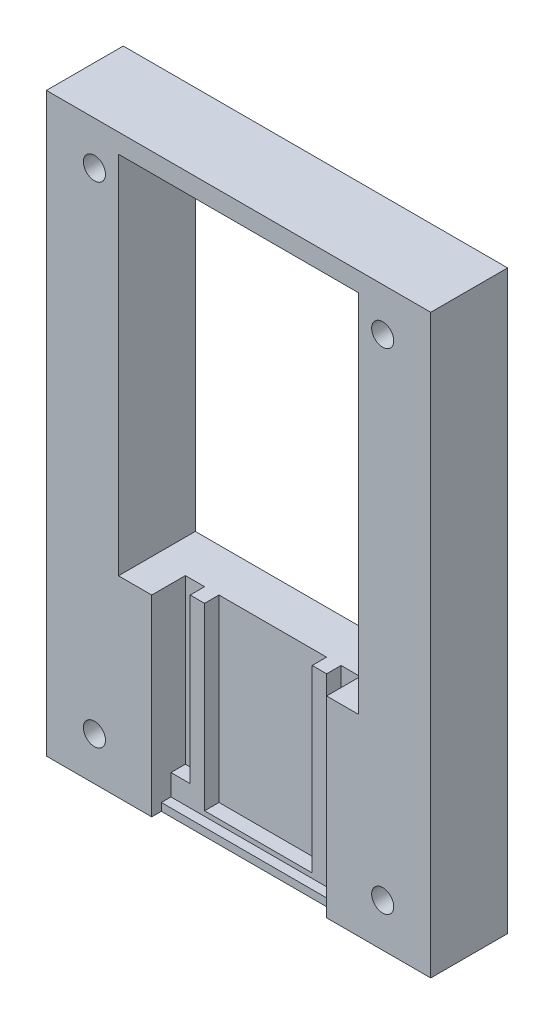
ISO-10303-21;
HEADER;
FILE_DESCRIPTION(('STEP AP214'),'2;1');
FILE_NAME('part.step','',(''),(''),'','','');
FILE_SCHEMA(('AUTOMOTIVE_DESIGN { 1 0 10303 214 1 1 1 1 }'));
ENDSEC;
DATA;
#1=APPLICATION_CONTEXT('core data for automotive mechanical design processes');
#2=APPLICATION_PROTOCOL_DEFINITION('international standard','automotive_design',2000,#1);
#3=PRODUCT_CONTEXT('',#1,'mechanical');
#4=PRODUCT('Part','Part','',(#3));
#5=PRODUCT_RELATED_PRODUCT_CATEGORY('part','',(#4));
#6=PRODUCT_DEFINITION_FORMATION('','',#4);
#7=PRODUCT_DEFINITION_CONTEXT('part definition',#1,'design');
#8=PRODUCT_DEFINITION('design','',#6,#7);
#9=PRODUCT_DEFINITION_SHAPE('','',#8);
#10=(LENGTH_UNIT() NAMED_UNIT(*) SI_UNIT(.MILLI.,.METRE.));
#11=(NAMED_UNIT(*) PLANE_ANGLE_UNIT() SI_UNIT($,.RADIAN.));
#12=(NAMED_UNIT(*) SI_UNIT($,.STERADIAN.) SOLID_ANGLE_UNIT());
#13=UNCERTAINTY_MEASURE_WITH_UNIT(LENGTH_MEASURE(1.E-05),#10,'distance_accuracy_value','');
#14=(GEOMETRIC_REPRESENTATION_CONTEXT(3) GLOBAL_UNCERTAINTY_ASSIGNED_CONTEXT((#13)) GLOBAL_UNIT_ASSIGNED_CONTEXT((#10,
#11,#12)) REPRESENTATION_CONTEXT('',''));
#15=CARTESIAN_POINT('',(0.,0.,0.));
#16=DIRECTION('',(0.,0.,1.));
#17=DIRECTION('',(1.,0.,0.));
#18=AXIS2_PLACEMENT_3D('',#15,#16,#17);
#19=CARTESIAN_POINT('',(0.,0.,6.));
#20=DIRECTION('',(0.,0.,-1.));
#21=DIRECTION('',(-1.,0.,0.));
#22=AXIS2_PLACEMENT_3D('',#19,#20,#21);
#23=PLANE('',#22);
#24=DIRECTION('',(0.,1.,0.));
#25=VECTOR('',#24,1.);
#26=CARTESIAN_POINT('',(25.6625098567106,1.3,6.));
#27=LINE('',#26,#25);
#28=CARTESIAN_POINT('',(25.6625098567106,1.3,6.));
#29=VERTEX_POINT('',#28);
#30=CARTESIAN_POINT('',(25.6625098567106,20.,6.));
#31=VERTEX_POINT('',#30);
#32=EDGE_CURVE('E221',#29,#31,#27,.T.);
#33=ORIENTED_EDGE('',*,*,#32,.F.);
#34=DIRECTION('',(1.,0.,0.));
#35=VECTOR('',#34,1.);
#36=CARTESIAN_POINT('',(25.6625098567106,1.3,6.));
#37=LINE('',#36,#35);
#38=CARTESIAN_POINT('',(14.4625098567106,1.3,6.));
#39=VERTEX_POINT('',#38);
#40=EDGE_CURVE('E205',#39,#29,#37,.T.);
#41=ORIENTED_EDGE('',*,*,#40,.F.);
#42=DIRECTION('',(0.,-1.,0.));
#43=VECTOR('',#42,1.);
#44=CARTESIAN_POINT('',(14.4625098567106,1.3,6.));
#45=LINE('',#44,#43);
#46=CARTESIAN_POINT('',(14.4625098567106,20.,6.));
#47=VERTEX_POINT('',#46);
#48=EDGE_CURVE('E219',#47,#39,#45,.T.);
#49=ORIENTED_EDGE('',*,*,#48,.F.);
#50=DIRECTION('',(1.,0.,0.));
#51=VECTOR('',#50,1.);
#52=CARTESIAN_POINT('',(7.5,20.,6.));
#53=LINE('',#52,#51);
#54=CARTESIAN_POINT('',(12.9625098567106,20.,6.));
#55=VERTEX_POINT('',#54);
#56=EDGE_CURVE('E401',#55,#47,#53,.T.);
#57=ORIENTED_EDGE('',*,*,#56,.F.);
#58=DIRECTION('',(0.,1.,0.));
#59=VECTOR('',#58,1.);
#60=CARTESIAN_POINT('',(12.9625098567106,20.,6.));
#61=LINE('',#60,#59);
#62=CARTESIAN_POINT('',(12.9625098567106,3.,6.));
#63=VERTEX_POINT('',#62);
#64=EDGE_CURVE('E253',#63,#55,#61,.T.);
#65=ORIENTED_EDGE('',*,*,#64,.F.);
#66=DIRECTION('',(1.,0.,0.));
#67=VECTOR('',#66,1.);
#68=CARTESIAN_POINT('',(10.9625098567106,3.,6.));
#69=LINE('',#68,#67);
#70=CARTESIAN_POINT('',(10.9625098567106,3.,6.));
#71=VERTEX_POINT('',#70);
#72=EDGE_CURVE('E261',#71,#63,#69,.T.);
#73=ORIENTED_EDGE('',*,*,#72,.F.);
#74=DIRECTION('',(0.,-1.,0.));
#75=VECTOR('',#74,1.);
#76=CARTESIAN_POINT('',(10.9625098567106,0.,6.));
#77=LINE('',#76,#75);
#78=CARTESIAN_POINT('',(10.9625098567106,0.8,6.));
#79=VERTEX_POINT('',#78);
#80=EDGE_CURVE('E297',#71,#79,#77,.T.);
#81=ORIENTED_EDGE('',*,*,#80,.T.);
#82=DIRECTION('',(-1.,0.,0.));
#83=VECTOR('',#82,1.);
#84=CARTESIAN_POINT('',(10.9625098567106,0.8,6.));
#85=LINE('',#84,#83);
#86=CARTESIAN_POINT('',(29.1625098567106,0.8,6.));
#87=VERTEX_POINT('',#86);
#88=EDGE_CURVE('E229',#87,#79,#85,.T.);
#89=ORIENTED_EDGE('',*,*,#88,.F.);
#90=DIRECTION('',(0.,1.,0.));
#91=VECTOR('',#90,1.);
#92=CARTESIAN_POINT('',(29.1625098567106,0.,6.));
#93=LINE('',#92,#91);
#94=CARTESIAN_POINT('',(29.1625098567106,3.,6.));
#95=VERTEX_POINT('',#94);
#96=EDGE_CURVE('E303',#87,#95,#93,.T.);
#97=ORIENTED_EDGE('',*,*,#96,.T.);
#98=DIRECTION('',(1.,0.,0.));
#99=VECTOR('',#98,1.);
#100=CARTESIAN_POINT('',(29.1625098567106,3.,6.));
#101=LINE('',#100,#99);
#102=CARTESIAN_POINT('',(27.1625098567106,3.,6.));
#103=VERTEX_POINT('',#102);
#104=EDGE_CURVE('E281',#103,#95,#101,.T.);
#105=ORIENTED_EDGE('',*,*,#104,.F.);
#106=DIRECTION('',(0.,-1.,0.));
#107=VECTOR('',#106,1.);
#108=CARTESIAN_POINT('',(27.1625098567106,20.,6.));
#109=LINE('',#108,#107);
#110=CARTESIAN_POINT('',(27.1625098567106,20.,6.));
#111=VERTEX_POINT('',#110);
#112=EDGE_CURVE('E267',#111,#103,#109,.T.);
#113=ORIENTED_EDGE('',*,*,#112,.F.);
#114=EDGE_CURVE('E405',#31,#111,#53,.T.);
#115=ORIENTED_EDGE('',*,*,#114,.F.);
#116=EDGE_LOOP('',(#33,#41,#49,#57,#65,#73,#81,#89,#97,#105,#113,#115));
#117=FACE_BOUND('',#116,.T.);
#118=ADVANCED_FACE('F39',(#117),#23,.F.);
#119=CARTESIAN_POINT('',(10.9625098567106,0.,6.));
#120=DIRECTION('',(-1.,0.,0.));
#121=DIRECTION('',(0.,0.,1.));
#122=AXIS2_PLACEMENT_3D('',#119,#120,#121);
#123=PLANE('',#122);
#124=DIRECTION('',(0.,-1.,0.));
#125=VECTOR('',#124,1.);
#126=CARTESIAN_POINT('',(10.9625098567106,0.,7.));
#127=LINE('',#126,#125);
#128=CARTESIAN_POINT('',(10.9625098567106,0.8,7.));
#129=VERTEX_POINT('',#128);
#130=CARTESIAN_POINT('',(10.9625098567106,0.,7.));
#131=VERTEX_POINT('',#130);
#132=EDGE_CURVE('E61',#129,#131,#127,.T.);
#133=ORIENTED_EDGE('',*,*,#132,.F.);
#134=DIRECTION('',(0.,0.,-1.));
#135=VECTOR('',#134,1.);
#136=CARTESIAN_POINT('',(10.9625098567106,0.8,7.));
#137=LINE('',#136,#135);
#138=EDGE_CURVE('E243',#129,#79,#137,.T.);
#139=ORIENTED_EDGE('',*,*,#138,.T.);
#140=ORIENTED_EDGE('',*,*,#80,.F.);
#141=DIRECTION('',(0.,0.,1.));
#142=VECTOR('',#141,1.);
#143=CARTESIAN_POINT('',(10.9625098567106,3.,4.5));
#144=LINE('',#143,#142);
#145=CARTESIAN_POINT('',(10.9625098567106,3.,4.5));
#146=VERTEX_POINT('',#145);
#147=EDGE_CURVE('E264',#146,#71,#144,.T.);
#148=ORIENTED_EDGE('',*,*,#147,.F.);
#149=DIRECTION('',(0.,-1.,0.));
#150=VECTOR('',#149,1.);
#151=CARTESIAN_POINT('',(10.9625098567106,20.,4.5));
#152=LINE('',#151,#150);
#153=CARTESIAN_POINT('',(10.9625098567106,20.,4.5));
#154=VERTEX_POINT('',#153);
#155=EDGE_CURVE('E252',#154,#146,#152,.T.);
#156=ORIENTED_EDGE('',*,*,#155,.F.);
#157=DIRECTION('',(0.,0.,-1.));
#158=VECTOR('',#157,1.);
#159=CARTESIAN_POINT('',(10.9625098567106,20.,0.));
#160=LINE('',#159,#158);
#161=CARTESIAN_POINT('',(10.9625098567106,20.,8.));
#162=VERTEX_POINT('',#161);
#163=EDGE_CURVE('E11',#162,#154,#160,.T.);
#164=ORIENTED_EDGE('',*,*,#163,.F.);
#165=DIRECTION('',(0.,-1.,0.));
#166=VECTOR('',#165,1.);
#167=CARTESIAN_POINT('',(10.9625098567106,0.,8.));
#168=LINE('',#167,#166);
#169=CARTESIAN_POINT('',(10.9625098567106,0.,8.));
#170=VERTEX_POINT('',#169);
#171=EDGE_CURVE('E275',#162,#170,#168,.T.);
#172=ORIENTED_EDGE('',*,*,#171,.T.);
#173=DIRECTION('',(0.,0.,1.));
#174=VECTOR('',#173,1.);
#175=CARTESIAN_POINT('',(10.9625098567106,0.,6.));
#176=LINE('',#175,#174);
#177=EDGE_CURVE('E306',#131,#170,#176,.T.);
#178=ORIENTED_EDGE('',*,*,#177,.F.);
#179=EDGE_LOOP('',(#133,#139,#140,#148,#156,#164,#172,#178));
#180=FACE_BOUND('',#179,.T.);
#181=ADVANCED_FACE('F434',(#180),#123,.F.);
#182=CARTESIAN_POINT('',(29.1625098567106,0.,6.));
#183=DIRECTION('',(1.,0.,0.));
#184=DIRECTION('',(0.,0.,-1.));
#185=AXIS2_PLACEMENT_3D('',#182,#183,#184);
#186=PLANE('',#185);
#187=DIRECTION('',(0.,0.,-1.));
#188=VECTOR('',#187,1.);
#189=CARTESIAN_POINT('',(29.1625098567106,0.8,7.));
#190=LINE('',#189,#188);
#191=CARTESIAN_POINT('',(29.1625098567106,0.8,7.));
#192=VERTEX_POINT('',#191);
#193=EDGE_CURVE('E250',#192,#87,#190,.T.);
#194=ORIENTED_EDGE('',*,*,#193,.F.);
#195=DIRECTION('',(0.,1.,0.));
#196=VECTOR('',#195,1.);
#197=CARTESIAN_POINT('',(29.1625098567106,0.,7.));
#198=LINE('',#197,#196);
#199=CARTESIAN_POINT('',(29.1625098567106,0.,7.));
#200=VERTEX_POINT('',#199);
#201=EDGE_CURVE('E238',#200,#192,#198,.T.);
#202=ORIENTED_EDGE('',*,*,#201,.F.);
#203=DIRECTION('',(0.,0.,1.));
#204=VECTOR('',#203,1.);
#205=CARTESIAN_POINT('',(29.1625098567106,0.,6.));
#206=LINE('',#205,#204);
#207=CARTESIAN_POINT('',(29.1625098567106,0.,8.));
#208=VERTEX_POINT('',#207);
#209=EDGE_CURVE('E309',#200,#208,#206,.T.);
#210=ORIENTED_EDGE('',*,*,#209,.T.);
#211=DIRECTION('',(0.,1.,0.));
#212=VECTOR('',#211,1.);
#213=CARTESIAN_POINT('',(29.1625098567106,0.,8.));
#214=LINE('',#213,#212);
#215=CARTESIAN_POINT('',(29.1625098567106,20.,8.));
#216=VERTEX_POINT('',#215);
#217=EDGE_CURVE('E302',#208,#216,#214,.T.);
#218=ORIENTED_EDGE('',*,*,#217,.T.);
#219=DIRECTION('',(0.,0.,1.));
#220=VECTOR('',#219,1.);
#221=CARTESIAN_POINT('',(29.1625098567106,20.,0.));
#222=LINE('',#221,#220);
#223=CARTESIAN_POINT('',(29.1625098567106,20.,4.5));
#224=VERTEX_POINT('',#223);
#225=EDGE_CURVE('E50',#224,#216,#222,.T.);
#226=ORIENTED_EDGE('',*,*,#225,.F.);
#227=DIRECTION('',(0.,1.,0.));
#228=VECTOR('',#227,1.);
#229=CARTESIAN_POINT('',(29.1625098567106,20.,4.5));
#230=LINE('',#229,#228);
#231=CARTESIAN_POINT('',(29.1625098567106,3.,4.5));
#232=VERTEX_POINT('',#231);
#233=EDGE_CURVE('E287',#232,#224,#230,.T.);
#234=ORIENTED_EDGE('',*,*,#233,.F.);
#235=DIRECTION('',(0.,0.,1.));
#236=VECTOR('',#235,1.);
#237=CARTESIAN_POINT('',(29.1625098567106,3.,4.5));
#238=LINE('',#237,#236);
#239=EDGE_CURVE('E249',#232,#95,#238,.T.);
#240=ORIENTED_EDGE('',*,*,#239,.T.);
#241=ORIENTED_EDGE('',*,*,#96,.F.);
#242=EDGE_LOOP('',(#194,#202,#210,#218,#226,#234,#240,#241));
#243=FACE_BOUND('',#242,.T.);
#244=ADVANCED_FACE('F467',(#243),#186,.F.);
#245=CARTESIAN_POINT('',(0.,0.,8.));
#246=DIRECTION('',(0.,1.,0.));
#247=DIRECTION('',(-1.,0.,0.));
#248=AXIS2_PLACEMENT_3D('',#245,#246,#247);
#249=PLANE('',#248);
#250=DIRECTION('',(1.,0.,0.));
#251=VECTOR('',#250,1.);
#252=CARTESIAN_POINT('',(10.9625098567106,0.,7.));
#253=LINE('',#252,#251);
#254=EDGE_CURVE('E232',#131,#200,#253,.T.);
#255=ORIENTED_EDGE('',*,*,#254,.F.);
#256=ORIENTED_EDGE('',*,*,#177,.T.);
#257=DIRECTION('',(1.,0.,0.));
#258=VECTOR('',#257,1.);
#259=CARTESIAN_POINT('',(0.,0.,8.));
#260=LINE('',#259,#258);
#261=CARTESIAN_POINT('',(0.,0.,8.));
#262=VERTEX_POINT('',#261);
#263=EDGE_CURVE('E375',#262,#170,#260,.T.);
#264=ORIENTED_EDGE('',*,*,#263,.F.);
#265=DIRECTION('',(0.,0.,-1.));
#266=VECTOR('',#265,1.);
#267=CARTESIAN_POINT('',(0.,0.,8.));
#268=LINE('',#267,#266);
#269=CARTESIAN_POINT('',(0.,0.,0.));
#270=VERTEX_POINT('',#269);
#271=EDGE_CURVE('E385',#262,#270,#268,.T.);
#272=ORIENTED_EDGE('',*,*,#271,.T.);
#273=DIRECTION('',(1.,0.,0.));
#274=VECTOR('',#273,1.);
#275=CARTESIAN_POINT('',(0.,0.,0.));
#276=LINE('',#275,#274);
#277=CARTESIAN_POINT('',(40.,0.,0.));
#278=VERTEX_POINT('',#277);
#279=EDGE_CURVE('E367',#270,#278,#276,.T.);
#280=ORIENTED_EDGE('',*,*,#279,.T.);
#281=DIRECTION('',(0.,0.,-1.));
#282=VECTOR('',#281,1.);
#283=CARTESIAN_POINT('',(40.,0.,8.));
#284=LINE('',#283,#282);
#285=CARTESIAN_POINT('',(40.,0.,8.));
#286=VERTEX_POINT('',#285);
#287=EDGE_CURVE('E398',#286,#278,#284,.T.);
#288=ORIENTED_EDGE('',*,*,#287,.F.);
#289=EDGE_CURVE('E376',#208,#286,#260,.T.);
#290=ORIENTED_EDGE('',*,*,#289,.F.);
#291=ORIENTED_EDGE('',*,*,#209,.F.);
#292=EDGE_LOOP('',(#255,#256,#264,#272,#280,#288,#290,#291));
#293=FACE_BOUND('',#292,.T.);
#294=ADVANCED_FACE('F41',(#293),#249,.F.);
#295=CARTESIAN_POINT('',(40.,0.,8.));
#296=DIRECTION('',(-1.,0.,0.));
#297=DIRECTION('',(0.,0.,1.));
#298=AXIS2_PLACEMENT_3D('',#295,#296,#297);
#299=PLANE('',#298);
#300=DIRECTION('',(0.,1.,0.));
#301=VECTOR('',#300,1.);
#302=CARTESIAN_POINT('',(40.,0.,0.));
#303=LINE('',#302,#301);
#304=CARTESIAN_POINT('',(40.,60.,0.));
#305=VERTEX_POINT('',#304);
#306=EDGE_CURVE('E383',#278,#305,#303,.T.);
#307=ORIENTED_EDGE('',*,*,#306,.T.);
#308=DIRECTION('',(0.,0.,-1.));
#309=VECTOR('',#308,1.);
#310=CARTESIAN_POINT('',(40.,60.,8.));
#311=LINE('',#310,#309);
#312=CARTESIAN_POINT('',(40.,60.,8.));
#313=VERTEX_POINT('',#312);
#314=EDGE_CURVE('E396',#313,#305,#311,.T.);
#315=ORIENTED_EDGE('',*,*,#314,.F.);
#316=DIRECTION('',(0.,1.,0.));
#317=VECTOR('',#316,1.);
#318=CARTESIAN_POINT('',(40.,0.,8.));
#319=LINE('',#318,#317);
#320=EDGE_CURVE('E374',#286,#313,#319,.T.);
#321=ORIENTED_EDGE('',*,*,#320,.F.);
#322=ORIENTED_EDGE('',*,*,#287,.T.);
#323=EDGE_LOOP('',(#307,#315,#321,#322));
#324=FACE_BOUND('',#323,.T.);
#325=ADVANCED_FACE('F476',(#324),#299,.F.);
#326=CARTESIAN_POINT('',(0.,60.,8.));
#327=DIRECTION('',(0.,-1.,0.));
#328=DIRECTION('',(1.,0.,0.));
#329=AXIS2_PLACEMENT_3D('',#326,#327,#328);
#330=PLANE('',#329);
#331=DIRECTION('',(-1.,0.,0.));
#332=VECTOR('',#331,1.);
#333=CARTESIAN_POINT('',(0.,60.,0.));
#334=LINE('',#333,#332);
#335=CARTESIAN_POINT('',(0.,60.,0.));
#336=VERTEX_POINT('',#335);
#337=EDGE_CURVE('E386',#305,#336,#334,.T.);
#338=ORIENTED_EDGE('',*,*,#337,.T.);
#339=DIRECTION('',(0.,0.,-1.));
#340=VECTOR('',#339,1.);
#341=CARTESIAN_POINT('',(0.,60.,8.));
#342=LINE('',#341,#340);
#343=CARTESIAN_POINT('',(0.,60.,8.));
#344=VERTEX_POINT('',#343);
#345=EDGE_CURVE('E394',#344,#336,#342,.T.);
#346=ORIENTED_EDGE('',*,*,#345,.F.);
#347=DIRECTION('',(-1.,0.,0.));
#348=VECTOR('',#347,1.);
#349=CARTESIAN_POINT('',(0.,60.,8.));
#350=LINE('',#349,#348);
#351=EDGE_CURVE('E377',#313,#344,#350,.T.);
#352=ORIENTED_EDGE('',*,*,#351,.F.);
#353=ORIENTED_EDGE('',*,*,#314,.T.);
#354=EDGE_LOOP('',(#338,#346,#352,#353));
#355=FACE_BOUND('',#354,.T.);
#356=ADVANCED_FACE('F483',(#355),#330,.F.);
#357=CARTESIAN_POINT('',(0.,0.,8.));
#358=DIRECTION('',(1.,0.,0.));
#359=DIRECTION('',(0.,0.,-1.));
#360=AXIS2_PLACEMENT_3D('',#357,#358,#359);
#361=PLANE('',#360);
#362=DIRECTION('',(0.,-1.,0.));
#363=VECTOR('',#362,1.);
#364=CARTESIAN_POINT('',(0.,0.,0.));
#365=LINE('',#364,#363);
#366=EDGE_CURVE('E388',#336,#270,#365,.T.);
#367=ORIENTED_EDGE('',*,*,#366,.T.);
#368=ORIENTED_EDGE('',*,*,#271,.F.);
#369=DIRECTION('',(0.,-1.,0.));
#370=VECTOR('',#369,1.);
#371=CARTESIAN_POINT('',(0.,0.,8.));
#372=LINE('',#371,#370);
#373=EDGE_CURVE('E379',#344,#262,#372,.T.);
#374=ORIENTED_EDGE('',*,*,#373,.F.);
#375=ORIENTED_EDGE('',*,*,#345,.T.);
#376=EDGE_LOOP('',(#367,#368,#374,#375));
#377=FACE_BOUND('',#376,.T.);
#378=ADVANCED_FACE('F486',(#377),#361,.F.);
#379=CARTESIAN_POINT('',(0.,0.,8.));
#380=DIRECTION('',(0.,0.,1.));
#381=DIRECTION('',(1.,0.,0.));
#382=AXIS2_PLACEMENT_3D('',#379,#380,#381);
#383=PLANE('',#382);
#384=ORIENTED_EDGE('',*,*,#171,.F.);
#385=DIRECTION('',(1.,0.,0.));
#386=VECTOR('',#385,1.);
#387=CARTESIAN_POINT('',(7.5,20.,8.));
#388=LINE('',#387,#386);
#389=CARTESIAN_POINT('',(7.5,20.,8.));
#390=VERTEX_POINT('',#389);
#391=EDGE_CURVE('E328',#390,#162,#388,.T.);
#392=ORIENTED_EDGE('',*,*,#391,.F.);
#393=DIRECTION('',(0.,-1.,0.));
#394=VECTOR('',#393,1.);
#395=CARTESIAN_POINT('',(7.5,58.,8.));
#396=LINE('',#395,#394);
#397=CARTESIAN_POINT('',(7.5,58.,8.));
#398=VERTEX_POINT('',#397);
#399=EDGE_CURVE('E315',#398,#390,#396,.T.);
#400=ORIENTED_EDGE('',*,*,#399,.F.);
#401=DIRECTION('',(-1.,0.,0.));
#402=VECTOR('',#401,1.);
#403=CARTESIAN_POINT('',(7.5,58.,8.));
#404=LINE('',#403,#402);
#405=CARTESIAN_POINT('',(32.5,58.,8.));
#406=VERTEX_POINT('',#405);
#407=EDGE_CURVE('E319',#406,#398,#404,.T.);
#408=ORIENTED_EDGE('',*,*,#407,.F.);
#409=DIRECTION('',(0.,1.,0.));
#410=VECTOR('',#409,1.);
#411=CARTESIAN_POINT('',(32.5,58.,8.));
#412=LINE('',#411,#410);
#413=CARTESIAN_POINT('',(32.5,20.,8.));
#414=VERTEX_POINT('',#413);
#415=EDGE_CURVE('E334',#414,#406,#412,.T.);
#416=ORIENTED_EDGE('',*,*,#415,.F.);
#417=EDGE_CURVE('E326',#216,#414,#388,.T.);
#418=ORIENTED_EDGE('',*,*,#417,.F.);
#419=ORIENTED_EDGE('',*,*,#217,.F.);
#420=ORIENTED_EDGE('',*,*,#289,.T.);
#421=ORIENTED_EDGE('',*,*,#320,.T.);
#422=ORIENTED_EDGE('',*,*,#351,.T.);
#423=ORIENTED_EDGE('',*,*,#373,.T.);
#424=ORIENTED_EDGE('',*,*,#263,.T.);
#425=EDGE_LOOP('',(#384,#392,#400,#408,#416,#418,#419,#420,#421,#422,#423,#424));
#426=FACE_BOUND('',#425,.T.);
#427=CARTESIAN_POINT('',(35.,4.5,8.));
#428=DIRECTION('',(0.,0.,1.));
#429=DIRECTION('',(1.,0.,0.));
#430=AXIS2_PLACEMENT_3D('',#427,#428,#429);
#431=CIRCLE('',#430,1.15);
#432=CARTESIAN_POINT('',(36.15,4.5,8.));
#433=VERTEX_POINT('',#432);
#434=EDGE_CURVE('E353',#433,#433,#431,.T.);
#435=ORIENTED_EDGE('',*,*,#434,.F.);
#436=EDGE_LOOP('',(#435));
#437=FACE_BOUND('',#436,.T.);
#438=CARTESIAN_POINT('',(5.00000000000001,55.5,8.));
#439=DIRECTION('',(0.,0.,1.));
#440=DIRECTION('',(1.,0.,0.));
#441=AXIS2_PLACEMENT_3D('',#438,#439,#440);
#442=CIRCLE('',#441,1.15);
#443=CARTESIAN_POINT('',(6.15000000000001,55.5,8.));
#444=VERTEX_POINT('',#443);
#445=EDGE_CURVE('E363',#444,#444,#442,.T.);
#446=ORIENTED_EDGE('',*,*,#445,.F.);
#447=EDGE_LOOP('',(#446));
#448=FACE_BOUND('',#447,.T.);
#449=CARTESIAN_POINT('',(35.,55.5,8.));
#450=DIRECTION('',(0.,0.,1.));
#451=DIRECTION('',(1.,0.,0.));
#452=AXIS2_PLACEMENT_3D('',#449,#450,#451);
#453=CIRCLE('',#452,1.15);
#454=CARTESIAN_POINT('',(36.15,55.5,8.));
#455=VERTEX_POINT('',#454);
#456=EDGE_CURVE('E349',#455,#455,#453,.T.);
#457=ORIENTED_EDGE('',*,*,#456,.F.);
#458=EDGE_LOOP('',(#457));
#459=FACE_BOUND('',#458,.T.);
#460=CARTESIAN_POINT('',(5.00000000000001,4.5,8.));
#461=DIRECTION('',(0.,0.,1.));
#462=DIRECTION('',(1.,0.,0.));
#463=AXIS2_PLACEMENT_3D('',#460,#461,#462);
#464=CIRCLE('',#463,1.15);
#465=CARTESIAN_POINT('',(6.15000000000001,4.5,8.));
#466=VERTEX_POINT('',#465);
#467=EDGE_CURVE('E357',#466,#466,#464,.T.);
#468=ORIENTED_EDGE('',*,*,#467,.F.);
#469=EDGE_LOOP('',(#468));
#470=FACE_BOUND('',#469,.T.);
#471=ADVANCED_FACE('F419',(#426,#437,#448,#459,#470),#383,.T.);
#472=CARTESIAN_POINT('',(0.,0.,0.));
#473=DIRECTION('',(0.,0.,1.));
#474=DIRECTION('',(1.,0.,0.));
#475=AXIS2_PLACEMENT_3D('',#472,#473,#474);
#476=PLANE('',#475);
#477=DIRECTION('',(-1.,0.,0.));
#478=VECTOR('',#477,1.);
#479=CARTESIAN_POINT('',(7.5,58.,0.));
#480=LINE('',#479,#478);
#481=CARTESIAN_POINT('',(32.5,58.,0.));
#482=VERTEX_POINT('',#481);
#483=CARTESIAN_POINT('',(7.5,58.,0.));
#484=VERTEX_POINT('',#483);
#485=EDGE_CURVE('E323',#482,#484,#480,.T.);
#486=ORIENTED_EDGE('',*,*,#485,.T.);
#487=DIRECTION('',(0.,-1.,0.));
#488=VECTOR('',#487,1.);
#489=CARTESIAN_POINT('',(7.5,58.,0.));
#490=LINE('',#489,#488);
#491=CARTESIAN_POINT('',(7.5,20.,0.));
#492=VERTEX_POINT('',#491);
#493=EDGE_CURVE('E313',#484,#492,#490,.T.);
#494=ORIENTED_EDGE('',*,*,#493,.T.);
#495=DIRECTION('',(1.,0.,0.));
#496=VECTOR('',#495,1.);
#497=CARTESIAN_POINT('',(7.5,20.,0.));
#498=LINE('',#497,#496);
#499=CARTESIAN_POINT('',(32.5,20.,0.));
#500=VERTEX_POINT('',#499);
#501=EDGE_CURVE('E320',#492,#500,#498,.T.);
#502=ORIENTED_EDGE('',*,*,#501,.T.);
#503=DIRECTION('',(0.,1.,0.));
#504=VECTOR('',#503,1.);
#505=CARTESIAN_POINT('',(32.5,58.,0.));
#506=LINE('',#505,#504);
#507=EDGE_CURVE('E324',#500,#482,#506,.T.);
#508=ORIENTED_EDGE('',*,*,#507,.T.);
#509=EDGE_LOOP('',(#486,#494,#502,#508));
#510=FACE_BOUND('',#509,.T.);
#511=CARTESIAN_POINT('',(35.,4.5,0.));
#512=DIRECTION('',(0.,0.,1.));
#513=DIRECTION('',(1.,0.,0.));
#514=AXIS2_PLACEMENT_3D('',#511,#512,#513);
#515=CIRCLE('',#514,1.15);
#516=CARTESIAN_POINT('',(36.15,4.5,0.));
#517=VERTEX_POINT('',#516);
#518=EDGE_CURVE('E356',#517,#517,#515,.T.);
#519=ORIENTED_EDGE('',*,*,#518,.T.);
#520=EDGE_LOOP('',(#519));
#521=FACE_BOUND('',#520,.T.);
#522=CARTESIAN_POINT('',(5.00000000000001,55.5,0.));
#523=DIRECTION('',(0.,0.,1.));
#524=DIRECTION('',(1.,0.,0.));
#525=AXIS2_PLACEMENT_3D('',#522,#523,#524);
#526=CIRCLE('',#525,1.15);
#527=CARTESIAN_POINT('',(6.15000000000001,55.5,0.));
#528=VERTEX_POINT('',#527);
#529=EDGE_CURVE('E351',#528,#528,#526,.T.);
#530=ORIENTED_EDGE('',*,*,#529,.T.);
#531=EDGE_LOOP('',(#530));
#532=FACE_BOUND('',#531,.T.);
#533=CARTESIAN_POINT('',(35.,55.5,0.));
#534=DIRECTION('',(0.,0.,1.));
#535=DIRECTION('',(1.,0.,0.));
#536=AXIS2_PLACEMENT_3D('',#533,#534,#535);
#537=CIRCLE('',#536,1.15);
#538=CARTESIAN_POINT('',(36.15,55.5,0.));
#539=VERTEX_POINT('',#538);
#540=EDGE_CURVE('E338',#539,#539,#537,.T.);
#541=ORIENTED_EDGE('',*,*,#540,.T.);
#542=EDGE_LOOP('',(#541));
#543=FACE_BOUND('',#542,.T.);
#544=CARTESIAN_POINT('',(5.00000000000001,4.5,0.));
#545=DIRECTION('',(0.,0.,1.));
#546=DIRECTION('',(1.,0.,0.));
#547=AXIS2_PLACEMENT_3D('',#544,#545,#546);
#548=CIRCLE('',#547,1.15);
#549=CARTESIAN_POINT('',(6.15000000000001,4.5,0.));
#550=VERTEX_POINT('',#549);
#551=EDGE_CURVE('E366',#550,#550,#548,.T.);
#552=ORIENTED_EDGE('',*,*,#551,.T.);
#553=EDGE_LOOP('',(#552));
#554=FACE_BOUND('',#553,.T.);
#555=ORIENTED_EDGE('',*,*,#279,.F.);
#556=ORIENTED_EDGE('',*,*,#366,.F.);
#557=ORIENTED_EDGE('',*,*,#337,.F.);
#558=ORIENTED_EDGE('',*,*,#306,.F.);
#559=EDGE_LOOP('',(#555,#556,#557,#558));
#560=FACE_BOUND('',#559,.T.);
#561=ADVANCED_FACE('F426',(#510,#521,#532,#543,#554,#560),#476,.F.);
#562=CARTESIAN_POINT('',(5.00000000000001,4.5,0.));
#563=DIRECTION('',(0.,0.,1.));
#564=DIRECTION('',(1.,0.,0.));
#565=AXIS2_PLACEMENT_3D('',#562,#563,#564);
#566=CYLINDRICAL_SURFACE('',#565,1.15);
#567=ORIENTED_EDGE('',*,*,#551,.F.);
#568=EDGE_LOOP('',(#567));
#569=FACE_BOUND('',#568,.T.);
#570=ORIENTED_EDGE('',*,*,#467,.T.);
#571=EDGE_LOOP('',(#570));
#572=FACE_BOUND('',#571,.T.);
#573=ADVANCED_FACE('F491',(#569,#572),#566,.F.);
#574=CARTESIAN_POINT('',(35.,55.5,0.));
#575=DIRECTION('',(0.,0.,1.));
#576=DIRECTION('',(1.,0.,0.));
#577=AXIS2_PLACEMENT_3D('',#574,#575,#576);
#578=CYLINDRICAL_SURFACE('',#577,1.15);
#579=ORIENTED_EDGE('',*,*,#540,.F.);
#580=EDGE_LOOP('',(#579));
#581=FACE_BOUND('',#580,.T.);
#582=ORIENTED_EDGE('',*,*,#456,.T.);
#583=EDGE_LOOP('',(#582));
#584=FACE_BOUND('',#583,.T.);
#585=ADVANCED_FACE('F499',(#581,#584),#578,.F.);
#586=CARTESIAN_POINT('',(5.00000000000001,55.5,0.));
#587=DIRECTION('',(0.,0.,1.));
#588=DIRECTION('',(1.,0.,0.));
#589=AXIS2_PLACEMENT_3D('',#586,#587,#588);
#590=CYLINDRICAL_SURFACE('',#589,1.15);
#591=ORIENTED_EDGE('',*,*,#529,.F.);
#592=EDGE_LOOP('',(#591));
#593=FACE_BOUND('',#592,.T.);
#594=ORIENTED_EDGE('',*,*,#445,.T.);
#595=EDGE_LOOP('',(#594));
#596=FACE_BOUND('',#595,.T.);
#597=ADVANCED_FACE('F530',(#593,#596),#590,.F.);
#598=CARTESIAN_POINT('',(35.,4.5,0.));
#599=DIRECTION('',(0.,0.,1.));
#600=DIRECTION('',(1.,0.,0.));
#601=AXIS2_PLACEMENT_3D('',#598,#599,#600);
#602=CYLINDRICAL_SURFACE('',#601,1.15);
#603=ORIENTED_EDGE('',*,*,#518,.F.);
#604=EDGE_LOOP('',(#603));
#605=FACE_BOUND('',#604,.T.);
#606=ORIENTED_EDGE('',*,*,#434,.T.);
#607=EDGE_LOOP('',(#606));
#608=FACE_BOUND('',#607,.T.);
#609=ADVANCED_FACE('F527',(#605,#608),#602,.F.);
#610=CARTESIAN_POINT('',(7.5,58.,0.));
#611=DIRECTION('',(-1.,0.,0.));
#612=DIRECTION('',(0.,-1.,0.));
#613=AXIS2_PLACEMENT_3D('',#610,#611,#612);
#614=PLANE('',#613);
#615=ORIENTED_EDGE('',*,*,#399,.T.);
#616=DIRECTION('',(0.,0.,1.));
#617=VECTOR('',#616,1.);
#618=CARTESIAN_POINT('',(7.5,20.,0.));
#619=LINE('',#618,#617);
#620=EDGE_CURVE('E330',#492,#390,#619,.T.);
#621=ORIENTED_EDGE('',*,*,#620,.F.);
#622=ORIENTED_EDGE('',*,*,#493,.F.);
#623=DIRECTION('',(0.,0.,1.));
#624=VECTOR('',#623,1.);
#625=CARTESIAN_POINT('',(7.5,58.,0.));
#626=LINE('',#625,#624);
#627=EDGE_CURVE('E336',#484,#398,#626,.T.);
#628=ORIENTED_EDGE('',*,*,#627,.T.);
#629=EDGE_LOOP('',(#615,#621,#622,#628));
#630=FACE_BOUND('',#629,.T.);
#631=ADVANCED_FACE('F435',(#630),#614,.F.);
#632=CARTESIAN_POINT('',(7.5,58.,0.));
#633=DIRECTION('',(0.,1.,0.));
#634=DIRECTION('',(0.,0.,1.));
#635=AXIS2_PLACEMENT_3D('',#632,#633,#634);
#636=PLANE('',#635);
#637=ORIENTED_EDGE('',*,*,#407,.T.);
#638=ORIENTED_EDGE('',*,*,#627,.F.);
#639=ORIENTED_EDGE('',*,*,#485,.F.);
#640=DIRECTION('',(0.,0.,1.));
#641=VECTOR('',#640,1.);
#642=CARTESIAN_POINT('',(32.5,58.,0.));
#643=LINE('',#642,#641);
#644=EDGE_CURVE('E344',#482,#406,#643,.T.);
#645=ORIENTED_EDGE('',*,*,#644,.T.);
#646=EDGE_LOOP('',(#637,#638,#639,#645));
#647=FACE_BOUND('',#646,.T.);
#648=ADVANCED_FACE('F518',(#647),#636,.F.);
#649=CARTESIAN_POINT('',(32.5,58.,0.));
#650=DIRECTION('',(1.,0.,0.));
#651=DIRECTION('',(0.,1.,0.));
#652=AXIS2_PLACEMENT_3D('',#649,#650,#651);
#653=PLANE('',#652);
#654=ORIENTED_EDGE('',*,*,#415,.T.);
#655=ORIENTED_EDGE('',*,*,#644,.F.);
#656=ORIENTED_EDGE('',*,*,#507,.F.);
#657=DIRECTION('',(0.,0.,1.));
#658=VECTOR('',#657,1.);
#659=CARTESIAN_POINT('',(32.5,20.,0.));
#660=LINE('',#659,#658);
#661=EDGE_CURVE('E345',#500,#414,#660,.T.);
#662=ORIENTED_EDGE('',*,*,#661,.T.);
#663=EDGE_LOOP('',(#654,#655,#656,#662));
#664=FACE_BOUND('',#663,.T.);
#665=ADVANCED_FACE('F425',(#664),#653,.F.);
#666=CARTESIAN_POINT('',(7.5,20.,0.));
#667=DIRECTION('',(0.,-1.,0.));
#668=DIRECTION('',(1.,0.,0.));
#669=AXIS2_PLACEMENT_3D('',#666,#667,#668);
#670=PLANE('',#669);
#671=DIRECTION('',(-1.,0.,0.));
#672=VECTOR('',#671,1.);
#673=CARTESIAN_POINT('',(25.6625098567106,20.,4.5));
#674=LINE('',#673,#672);
#675=CARTESIAN_POINT('',(25.6625098567106,20.,4.5));
#676=VERTEX_POINT('',#675);
#677=CARTESIAN_POINT('',(14.4625098567106,20.,4.5));
#678=VERTEX_POINT('',#677);
#679=EDGE_CURVE('E213',#676,#678,#674,.T.);
#680=ORIENTED_EDGE('',*,*,#679,.F.);
#681=DIRECTION('',(0.,0.,1.));
#682=VECTOR('',#681,1.);
#683=CARTESIAN_POINT('',(25.6625098567106,20.,4.5));
#684=LINE('',#683,#682);
#685=EDGE_CURVE('E206',#676,#31,#684,.T.);
#686=ORIENTED_EDGE('',*,*,#685,.T.);
#687=ORIENTED_EDGE('',*,*,#114,.T.);
#688=DIRECTION('',(0.,0.,1.));
#689=VECTOR('',#688,1.);
#690=CARTESIAN_POINT('',(27.1625098567106,20.,4.5));
#691=LINE('',#690,#689);
#692=CARTESIAN_POINT('',(27.1625098567106,20.,4.5));
#693=VERTEX_POINT('',#692);
#694=EDGE_CURVE('E279',#693,#111,#691,.T.);
#695=ORIENTED_EDGE('',*,*,#694,.F.);
#696=DIRECTION('',(-1.,0.,0.));
#697=VECTOR('',#696,1.);
#698=CARTESIAN_POINT('',(29.1625098567106,20.,4.5));
#699=LINE('',#698,#697);
#700=EDGE_CURVE('E294',#224,#693,#699,.T.);
#701=ORIENTED_EDGE('',*,*,#700,.F.);
#702=ORIENTED_EDGE('',*,*,#225,.T.);
#703=ORIENTED_EDGE('',*,*,#417,.T.);
#704=ORIENTED_EDGE('',*,*,#661,.F.);
#705=ORIENTED_EDGE('',*,*,#501,.F.);
#706=ORIENTED_EDGE('',*,*,#620,.T.);
#707=ORIENTED_EDGE('',*,*,#391,.T.);
#708=ORIENTED_EDGE('',*,*,#163,.T.);
#709=DIRECTION('',(-1.,0.,0.));
#710=VECTOR('',#709,1.);
#711=CARTESIAN_POINT('',(10.9625098567106,20.,4.5));
#712=LINE('',#711,#710);
#713=CARTESIAN_POINT('',(12.9625098567106,20.,4.5));
#714=VERTEX_POINT('',#713);
#715=EDGE_CURVE('E257',#714,#154,#712,.T.);
#716=ORIENTED_EDGE('',*,*,#715,.F.);
#717=DIRECTION('',(0.,0.,1.));
#718=VECTOR('',#717,1.);
#719=CARTESIAN_POINT('',(12.9625098567106,20.,4.5));
#720=LINE('',#719,#718);
#721=EDGE_CURVE('E268',#714,#55,#720,.T.);
#722=ORIENTED_EDGE('',*,*,#721,.T.);
#723=ORIENTED_EDGE('',*,*,#56,.T.);
#724=DIRECTION('',(0.,0.,1.));
#725=VECTOR('',#724,1.);
#726=CARTESIAN_POINT('',(14.4625098567106,20.,4.5));
#727=LINE('',#726,#725);
#728=EDGE_CURVE('E233',#678,#47,#727,.T.);
#729=ORIENTED_EDGE('',*,*,#728,.F.);
#730=EDGE_LOOP('',(#680,#686,#687,#695,#701,#702,#703,#704,#705,#706,#707,#708,#716,#722,#723,#729));
#731=FACE_BOUND('',#730,.T.);
#732=ADVANCED_FACE('F408',(#731),#670,.F.);
#733=CARTESIAN_POINT('',(29.1625098567106,3.,4.5));
#734=DIRECTION('',(0.,-1.,0.));
#735=DIRECTION('',(1.,0.,0.));
#736=AXIS2_PLACEMENT_3D('',#733,#734,#735);
#737=PLANE('',#736);
#738=ORIENTED_EDGE('',*,*,#104,.T.);
#739=ORIENTED_EDGE('',*,*,#239,.F.);
#740=DIRECTION('',(1.,0.,0.));
#741=VECTOR('',#740,1.);
#742=CARTESIAN_POINT('',(29.1625098567106,3.,4.5));
#743=LINE('',#742,#741);
#744=CARTESIAN_POINT('',(27.1625098567106,3.,4.5));
#745=VERTEX_POINT('',#744);
#746=EDGE_CURVE('E278',#745,#232,#743,.T.);
#747=ORIENTED_EDGE('',*,*,#746,.F.);
#748=DIRECTION('',(0.,0.,1.));
#749=VECTOR('',#748,1.);
#750=CARTESIAN_POINT('',(27.1625098567106,3.,4.5));
#751=LINE('',#750,#749);
#752=EDGE_CURVE('E277',#745,#103,#751,.T.);
#753=ORIENTED_EDGE('',*,*,#752,.T.);
#754=EDGE_LOOP('',(#738,#739,#747,#753));
#755=FACE_BOUND('',#754,.T.);
#756=ADVANCED_FACE('F462',(#755),#737,.F.);
#757=CARTESIAN_POINT('',(27.1625098567106,20.,4.5));
#758=DIRECTION('',(-1.,0.,0.));
#759=DIRECTION('',(0.,-1.,0.));
#760=AXIS2_PLACEMENT_3D('',#757,#758,#759);
#761=PLANE('',#760);
#762=ORIENTED_EDGE('',*,*,#112,.T.);
#763=ORIENTED_EDGE('',*,*,#752,.F.);
#764=DIRECTION('',(0.,-1.,0.));
#765=VECTOR('',#764,1.);
#766=CARTESIAN_POINT('',(27.1625098567106,20.,4.5));
#767=LINE('',#766,#765);
#768=EDGE_CURVE('E292',#693,#745,#767,.T.);
#769=ORIENTED_EDGE('',*,*,#768,.F.);
#770=ORIENTED_EDGE('',*,*,#694,.T.);
#771=EDGE_LOOP('',(#762,#763,#769,#770));
#772=FACE_BOUND('',#771,.T.);
#773=ADVANCED_FACE('F459',(#772),#761,.F.);
#774=CARTESIAN_POINT('',(0.,0.,4.5));
#775=DIRECTION('',(0.,0.,-1.));
#776=DIRECTION('',(-1.,0.,0.));
#777=AXIS2_PLACEMENT_3D('',#774,#775,#776);
#778=PLANE('',#777);
#779=ORIENTED_EDGE('',*,*,#233,.T.);
#780=ORIENTED_EDGE('',*,*,#700,.T.);
#781=ORIENTED_EDGE('',*,*,#768,.T.);
#782=ORIENTED_EDGE('',*,*,#746,.T.);
#783=EDGE_LOOP('',(#779,#780,#781,#782));
#784=FACE_BOUND('',#783,.T.);
#785=ADVANCED_FACE('F465',(#784),#778,.F.);
#786=CARTESIAN_POINT('',(12.9625098567106,20.,4.5));
#787=DIRECTION('',(1.,0.,0.));
#788=DIRECTION('',(0.,1.,0.));
#789=AXIS2_PLACEMENT_3D('',#786,#787,#788);
#790=PLANE('',#789);
#791=ORIENTED_EDGE('',*,*,#64,.T.);
#792=ORIENTED_EDGE('',*,*,#721,.F.);
#793=DIRECTION('',(0.,1.,0.));
#794=VECTOR('',#793,1.);
#795=CARTESIAN_POINT('',(12.9625098567106,20.,4.5));
#796=LINE('',#795,#794);
#797=CARTESIAN_POINT('',(12.9625098567106,3.,4.5));
#798=VERTEX_POINT('',#797);
#799=EDGE_CURVE('E260',#798,#714,#796,.T.);
#800=ORIENTED_EDGE('',*,*,#799,.F.);
#801=DIRECTION('',(0.,0.,1.));
#802=VECTOR('',#801,1.);
#803=CARTESIAN_POINT('',(12.9625098567106,3.,4.5));
#804=LINE('',#803,#802);
#805=EDGE_CURVE('E271',#798,#63,#804,.T.);
#806=ORIENTED_EDGE('',*,*,#805,.T.);
#807=EDGE_LOOP('',(#791,#792,#800,#806));
#808=FACE_BOUND('',#807,.T.);
#809=ADVANCED_FACE('F447',(#808),#790,.F.);
#810=CARTESIAN_POINT('',(10.9625098567106,3.,4.5));
#811=DIRECTION('',(0.,-1.,0.));
#812=DIRECTION('',(0.,0.,-1.));
#813=AXIS2_PLACEMENT_3D('',#810,#811,#812);
#814=PLANE('',#813);
#815=ORIENTED_EDGE('',*,*,#72,.T.);
#816=ORIENTED_EDGE('',*,*,#805,.F.);
#817=DIRECTION('',(1.,0.,0.));
#818=VECTOR('',#817,1.);
#819=CARTESIAN_POINT('',(10.9625098567106,3.,4.5));
#820=LINE('',#819,#818);
#821=EDGE_CURVE('E251',#146,#798,#820,.T.);
#822=ORIENTED_EDGE('',*,*,#821,.F.);
#823=ORIENTED_EDGE('',*,*,#147,.T.);
#824=EDGE_LOOP('',(#815,#816,#822,#823));
#825=FACE_BOUND('',#824,.T.);
#826=ADVANCED_FACE('F617',(#825),#814,.F.);
#827=CARTESIAN_POINT('',(0.,0.,4.5));
#828=DIRECTION('',(0.,0.,1.));
#829=DIRECTION('',(1.,0.,0.));
#830=AXIS2_PLACEMENT_3D('',#827,#828,#829);
#831=PLANE('',#830);
#832=ORIENTED_EDGE('',*,*,#155,.T.);
#833=ORIENTED_EDGE('',*,*,#821,.T.);
#834=ORIENTED_EDGE('',*,*,#799,.T.);
#835=ORIENTED_EDGE('',*,*,#715,.T.);
#836=EDGE_LOOP('',(#832,#833,#834,#835));
#837=FACE_BOUND('',#836,.T.);
#838=ADVANCED_FACE('F445',(#837),#831,.T.);
#839=CARTESIAN_POINT('',(10.9625098567106,0.8,7.));
#840=DIRECTION('',(0.,-1.,0.));
#841=DIRECTION('',(0.,0.,-1.));
#842=AXIS2_PLACEMENT_3D('',#839,#840,#841);
#843=PLANE('',#842);
#844=ORIENTED_EDGE('',*,*,#88,.T.);
#845=ORIENTED_EDGE('',*,*,#138,.F.);
#846=DIRECTION('',(-1.,0.,0.));
#847=VECTOR('',#846,1.);
#848=CARTESIAN_POINT('',(10.9625098567106,0.8,7.));
#849=LINE('',#848,#847);
#850=EDGE_CURVE('E241',#192,#129,#849,.T.);
#851=ORIENTED_EDGE('',*,*,#850,.F.);
#852=ORIENTED_EDGE('',*,*,#193,.T.);
#853=EDGE_LOOP('',(#844,#845,#851,#852));
#854=FACE_BOUND('',#853,.T.);
#855=ADVANCED_FACE('F469',(#854),#843,.F.);
#856=CARTESIAN_POINT('',(0.,0.,7.));
#857=DIRECTION('',(0.,0.,-1.));
#858=DIRECTION('',(-1.,0.,0.));
#859=AXIS2_PLACEMENT_3D('',#856,#857,#858);
#860=PLANE('',#859);
#861=ORIENTED_EDGE('',*,*,#132,.T.);
#862=ORIENTED_EDGE('',*,*,#254,.T.);
#863=ORIENTED_EDGE('',*,*,#201,.T.);
#864=ORIENTED_EDGE('',*,*,#850,.T.);
#865=EDGE_LOOP('',(#861,#862,#863,#864));
#866=FACE_BOUND('',#865,.T.);
#867=ADVANCED_FACE('F471',(#866),#860,.F.);
#868=CARTESIAN_POINT('',(25.6625098567106,1.3,4.5));
#869=DIRECTION('',(0.,-1.,0.));
#870=DIRECTION('',(1.,0.,0.));
#871=AXIS2_PLACEMENT_3D('',#868,#869,#870);
#872=PLANE('',#871);
#873=ORIENTED_EDGE('',*,*,#40,.T.);
#874=DIRECTION('',(0.,0.,1.));
#875=VECTOR('',#874,1.);
#876=CARTESIAN_POINT('',(25.6625098567106,1.3,4.5));
#877=LINE('',#876,#875);
#878=CARTESIAN_POINT('',(25.6625098567106,1.3,4.5));
#879=VERTEX_POINT('',#878);
#880=EDGE_CURVE('E198',#879,#29,#877,.T.);
#881=ORIENTED_EDGE('',*,*,#880,.F.);
#882=DIRECTION('',(1.,0.,0.));
#883=VECTOR('',#882,1.);
#884=CARTESIAN_POINT('',(25.6625098567106,1.3,4.5));
#885=LINE('',#884,#883);
#886=CARTESIAN_POINT('',(14.4625098567106,1.3,4.5));
#887=VERTEX_POINT('',#886);
#888=EDGE_CURVE('E202',#887,#879,#885,.T.);
#889=ORIENTED_EDGE('',*,*,#888,.F.);
#890=DIRECTION('',(0.,0.,1.));
#891=VECTOR('',#890,1.);
#892=CARTESIAN_POINT('',(14.4625098567106,1.3,4.5));
#893=LINE('',#892,#891);
#894=EDGE_CURVE('E226',#887,#39,#893,.T.);
#895=ORIENTED_EDGE('',*,*,#894,.T.);
#896=EDGE_LOOP('',(#873,#881,#889,#895));
#897=FACE_BOUND('',#896,.T.);
#898=ADVANCED_FACE('F201',(#897),#872,.F.);
#899=CARTESIAN_POINT('',(14.4625098567106,1.3,4.5));
#900=DIRECTION('',(-1.,0.,0.));
#901=DIRECTION('',(0.,0.,1.));
#902=AXIS2_PLACEMENT_3D('',#899,#900,#901);
#903=PLANE('',#902);
#904=ORIENTED_EDGE('',*,*,#48,.T.);
#905=ORIENTED_EDGE('',*,*,#894,.F.);
#906=DIRECTION('',(0.,-1.,0.));
#907=VECTOR('',#906,1.);
#908=CARTESIAN_POINT('',(14.4625098567106,1.3,4.5));
#909=LINE('',#908,#907);
#910=EDGE_CURVE('E209',#678,#887,#909,.T.);
#911=ORIENTED_EDGE('',*,*,#910,.F.);
#912=ORIENTED_EDGE('',*,*,#728,.T.);
#913=EDGE_LOOP('',(#904,#905,#911,#912));
#914=FACE_BOUND('',#913,.T.);
#915=ADVANCED_FACE('F453',(#914),#903,.F.);
#916=CARTESIAN_POINT('',(25.6625098567106,1.3,4.5));
#917=DIRECTION('',(1.,0.,0.));
#918=DIRECTION('',(0.,0.,-1.));
#919=AXIS2_PLACEMENT_3D('',#916,#917,#918);
#920=PLANE('',#919);
#921=ORIENTED_EDGE('',*,*,#32,.T.);
#922=ORIENTED_EDGE('',*,*,#685,.F.);
#923=DIRECTION('',(0.,1.,0.));
#924=VECTOR('',#923,1.);
#925=CARTESIAN_POINT('',(25.6625098567106,1.3,4.5));
#926=LINE('',#925,#924);
#927=EDGE_CURVE('E53',#879,#676,#926,.T.);
#928=ORIENTED_EDGE('',*,*,#927,.F.);
#929=ORIENTED_EDGE('',*,*,#880,.T.);
#930=EDGE_LOOP('',(#921,#922,#928,#929));
#931=FACE_BOUND('',#930,.T.);
#932=ADVANCED_FACE('F214',(#931),#920,.F.);
#933=CARTESIAN_POINT('',(0.,0.,4.5));
#934=DIRECTION('',(0.,0.,-1.));
#935=DIRECTION('',(-1.,0.,0.));
#936=AXIS2_PLACEMENT_3D('',#933,#934,#935);
#937=PLANE('',#936);
#938=ORIENTED_EDGE('',*,*,#888,.T.);
#939=ORIENTED_EDGE('',*,*,#927,.T.);
#940=ORIENTED_EDGE('',*,*,#679,.T.);
#941=ORIENTED_EDGE('',*,*,#910,.T.);
#942=EDGE_LOOP('',(#938,#939,#940,#941));
#943=FACE_BOUND('',#942,.T.);
#944=ADVANCED_FACE('F217',(#943),#937,.F.);
#945=CLOSED_SHELL('',(#118,#181,#244,#294,#325,#356,#378,#471,#561,#573,#585,#597,#609,#631,
#648,#665,#732,#756,#773,#785,#809,#826,#838,#855,#867,#898,#915,#932,#944));
#946=MANIFOLD_SOLID_BREP('B2',#945);
#947=ADVANCED_BREP_SHAPE_REPRESENTATION('',(#18,#946),#14);
#948=SHAPE_DEFINITION_REPRESENTATION(#9,#947);
ENDSEC;
END-ISO-10303-21;
